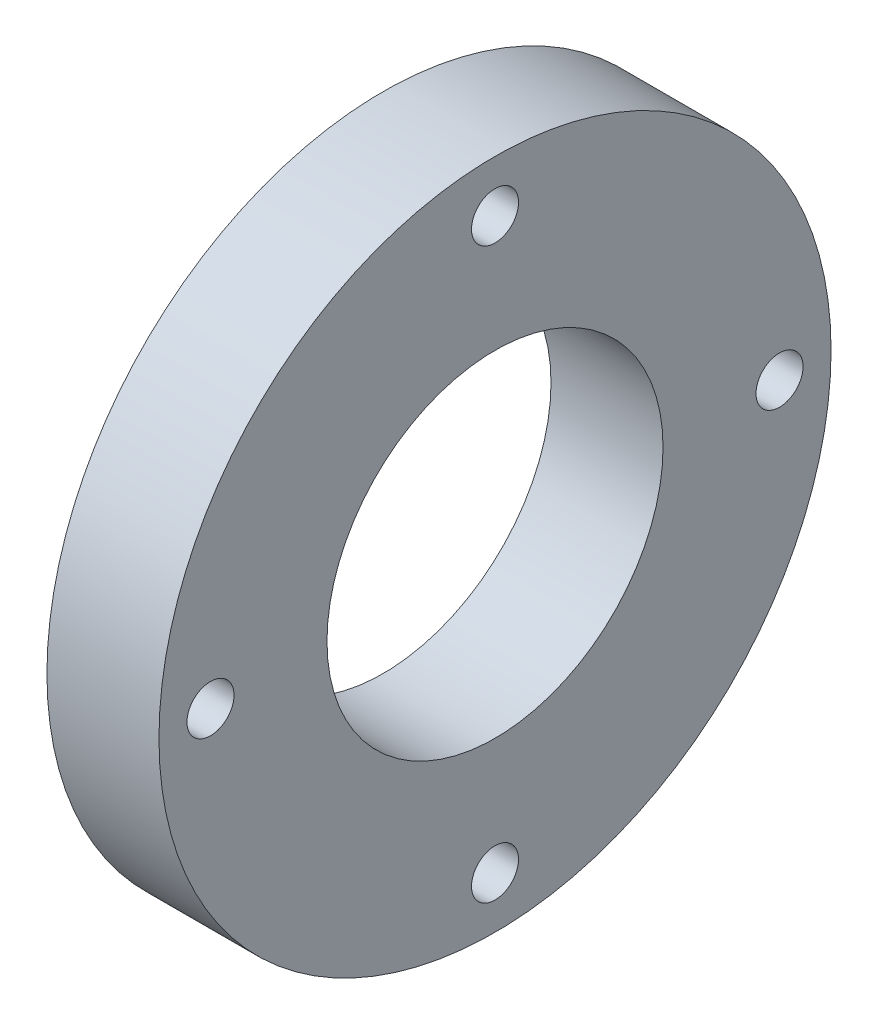
ISO-10303-21;
HEADER;
FILE_DESCRIPTION(('STEP AP214'),'2;1');
FILE_NAME('part.step','',(''),(''),'','','');
FILE_SCHEMA(('AUTOMOTIVE_DESIGN { 1 0 10303 214 1 1 1 1 }'));
ENDSEC;
DATA;
#1=APPLICATION_CONTEXT('core data for automotive mechanical design processes');
#2=APPLICATION_PROTOCOL_DEFINITION('international standard','automotive_design',2000,#1);
#3=PRODUCT_CONTEXT('',#1,'mechanical');
#4=PRODUCT('Part','Part','',(#3));
#5=PRODUCT_RELATED_PRODUCT_CATEGORY('part','',(#4));
#6=PRODUCT_DEFINITION_FORMATION('','',#4);
#7=PRODUCT_DEFINITION_CONTEXT('part definition',#1,'design');
#8=PRODUCT_DEFINITION('design','',#6,#7);
#9=PRODUCT_DEFINITION_SHAPE('','',#8);
#10=(LENGTH_UNIT() NAMED_UNIT(*) SI_UNIT(.MILLI.,.METRE.));
#11=(NAMED_UNIT(*) PLANE_ANGLE_UNIT() SI_UNIT($,.RADIAN.));
#12=(NAMED_UNIT(*) SI_UNIT($,.STERADIAN.) SOLID_ANGLE_UNIT());
#13=UNCERTAINTY_MEASURE_WITH_UNIT(LENGTH_MEASURE(1.E-05),#10,'distance_accuracy_value','');
#14=(GEOMETRIC_REPRESENTATION_CONTEXT(3) GLOBAL_UNCERTAINTY_ASSIGNED_CONTEXT((#13)) GLOBAL_UNIT_ASSIGNED_CONTEXT((#10,
#11,#12)) REPRESENTATION_CONTEXT('',''));
#15=CARTESIAN_POINT('',(0.,0.,0.));
#16=DIRECTION('',(0.,0.,1.));
#17=DIRECTION('',(1.,0.,0.));
#18=AXIS2_PLACEMENT_3D('',#15,#16,#17);
#19=CARTESIAN_POINT('',(21.,0.,0.));
#20=DIRECTION('',(1.,0.,0.));
#21=DIRECTION('',(0.,0.,-1.));
#22=AXIS2_PLACEMENT_3D('',#19,#20,#21);
#23=CYLINDRICAL_SURFACE('',#22,15.);
#24=CARTESIAN_POINT('',(21.,0.,0.));
#25=DIRECTION('',(1.,0.,0.));
#26=DIRECTION('',(0.,0.,-1.));
#27=AXIS2_PLACEMENT_3D('',#24,#25,#26);
#28=CIRCLE('',#27,15.);
#29=CARTESIAN_POINT('',(21.,0.,-15.));
#30=VERTEX_POINT('',#29);
#31=EDGE_CURVE('E10',#30,#30,#28,.T.);
#32=ORIENTED_EDGE('',*,*,#31,.T.);
#33=EDGE_LOOP('',(#32));
#34=FACE_BOUND('',#33,.T.);
#35=CARTESIAN_POINT('',(26.,0.,0.));
#36=DIRECTION('',(1.,0.,0.));
#37=DIRECTION('',(0.,0.,-1.));
#38=AXIS2_PLACEMENT_3D('',#35,#36,#37);
#39=CIRCLE('',#38,15.);
#40=CARTESIAN_POINT('',(26.,0.,-15.));
#41=VERTEX_POINT('',#40);
#42=EDGE_CURVE('E36',#41,#41,#39,.T.);
#43=ORIENTED_EDGE('',*,*,#42,.F.);
#44=EDGE_LOOP('',(#43));
#45=FACE_BOUND('',#44,.T.);
#46=ADVANCED_FACE('F30',(#34,#45),#23,.T.);
#47=CARTESIAN_POINT('',(21.,15.,0.));
#48=DIRECTION('',(-1.,0.,0.));
#49=DIRECTION('',(0.,0.,1.));
#50=AXIS2_PLACEMENT_3D('',#47,#48,#49);
#51=PLANE('',#50);
#52=CARTESIAN_POINT('',(21.,0.,0.));
#53=DIRECTION('',(-1.,0.,0.));
#54=DIRECTION('',(0.,0.,1.));
#55=AXIS2_PLACEMENT_3D('',#52,#53,#54);
#56=CIRCLE('',#55,7.49999999999999);
#57=CARTESIAN_POINT('',(21.,0.,7.49999999999999));
#58=VERTEX_POINT('',#57);
#59=EDGE_CURVE('E44',#58,#58,#56,.T.);
#60=ORIENTED_EDGE('',*,*,#59,.F.);
#61=EDGE_LOOP('',(#60));
#62=FACE_BOUND('',#61,.T.);
#63=ORIENTED_EDGE('',*,*,#31,.F.);
#64=EDGE_LOOP('',(#63));
#65=FACE_BOUND('',#64,.T.);
#66=ADVANCED_FACE('F80',(#62,#65),#51,.T.);
#67=CARTESIAN_POINT('',(26.,0.,0.));
#68=DIRECTION('',(1.,0.,0.));
#69=DIRECTION('',(0.,0.,-1.));
#70=AXIS2_PLACEMENT_3D('',#67,#68,#69);
#71=PLANE('',#70);
#72=CARTESIAN_POINT('',(26.,0.,12.7));
#73=DIRECTION('',(1.,0.,0.));
#74=DIRECTION('',(0.,0.,-1.));
#75=AXIS2_PLACEMENT_3D('',#72,#73,#74);
#76=CIRCLE('',#75,1.04999999999999);
#77=CARTESIAN_POINT('',(26.,0.,11.65));
#78=VERTEX_POINT('',#77);
#79=EDGE_CURVE('E70',#78,#78,#76,.T.);
#80=ORIENTED_EDGE('',*,*,#79,.F.);
#81=EDGE_LOOP('',(#80));
#82=FACE_BOUND('',#81,.T.);
#83=CARTESIAN_POINT('',(26.,0.,-12.7));
#84=DIRECTION('',(1.,0.,0.));
#85=DIRECTION('',(0.,0.,-1.));
#86=AXIS2_PLACEMENT_3D('',#83,#84,#85);
#87=CIRCLE('',#86,1.04999999999999);
#88=CARTESIAN_POINT('',(26.,0.,-13.75));
#89=VERTEX_POINT('',#88);
#90=EDGE_CURVE('E64',#89,#89,#87,.T.);
#91=ORIENTED_EDGE('',*,*,#90,.F.);
#92=EDGE_LOOP('',(#91));
#93=FACE_BOUND('',#92,.T.);
#94=CARTESIAN_POINT('',(26.,-12.7,0.));
#95=DIRECTION('',(1.,0.,0.));
#96=DIRECTION('',(0.,0.,-1.));
#97=AXIS2_PLACEMENT_3D('',#94,#95,#96);
#98=CIRCLE('',#97,1.04999999999999);
#99=CARTESIAN_POINT('',(26.,-12.7,-1.04999999999999));
#100=VERTEX_POINT('',#99);
#101=EDGE_CURVE('E58',#100,#100,#98,.T.);
#102=ORIENTED_EDGE('',*,*,#101,.F.);
#103=EDGE_LOOP('',(#102));
#104=FACE_BOUND('',#103,.T.);
#105=CARTESIAN_POINT('',(26.,12.7,0.));
#106=DIRECTION('',(1.,0.,0.));
#107=DIRECTION('',(0.,0.,-1.));
#108=AXIS2_PLACEMENT_3D('',#105,#106,#107);
#109=CIRCLE('',#108,1.04999999999999);
#110=CARTESIAN_POINT('',(26.,12.7,-1.04999999999999));
#111=VERTEX_POINT('',#110);
#112=EDGE_CURVE('E52',#111,#111,#109,.T.);
#113=ORIENTED_EDGE('',*,*,#112,.F.);
#114=EDGE_LOOP('',(#113));
#115=FACE_BOUND('',#114,.T.);
#116=CARTESIAN_POINT('',(26.,0.,0.));
#117=DIRECTION('',(-1.,0.,0.));
#118=DIRECTION('',(0.,0.,1.));
#119=AXIS2_PLACEMENT_3D('',#116,#117,#118);
#120=CIRCLE('',#119,7.49999999999999);
#121=CARTESIAN_POINT('',(26.,0.,7.49999999999999));
#122=VERTEX_POINT('',#121);
#123=EDGE_CURVE('E40',#122,#122,#120,.T.);
#124=ORIENTED_EDGE('',*,*,#123,.T.);
#125=EDGE_LOOP('',(#124));
#126=FACE_BOUND('',#125,.T.);
#127=ORIENTED_EDGE('',*,*,#42,.T.);
#128=EDGE_LOOP('',(#127));
#129=FACE_BOUND('',#128,.T.);
#130=ADVANCED_FACE('F76',(#82,#93,#104,#115,#126,#129),#71,.T.);
#131=CARTESIAN_POINT('',(21.,0.,0.));
#132=DIRECTION('',(-1.,0.,0.));
#133=DIRECTION('',(0.,0.,1.));
#134=AXIS2_PLACEMENT_3D('',#131,#132,#133);
#135=CYLINDRICAL_SURFACE('',#134,7.49999999999999);
#136=ORIENTED_EDGE('',*,*,#123,.F.);
#137=EDGE_LOOP('',(#136));
#138=FACE_BOUND('',#137,.T.);
#139=ORIENTED_EDGE('',*,*,#59,.T.);
#140=EDGE_LOOP('',(#139));
#141=FACE_BOUND('',#140,.T.);
#142=ADVANCED_FACE('F79',(#138,#141),#135,.F.);
#143=CARTESIAN_POINT('',(23.5,12.7,0.));
#144=DIRECTION('',(-1.,0.,0.));
#145=DIRECTION('',(0.,0.,1.));
#146=AXIS2_PLACEMENT_3D('',#143,#144,#145);
#147=PLANE('',#146);
#148=CARTESIAN_POINT('',(23.5,12.7,0.));
#149=DIRECTION('',(1.,0.,0.));
#150=DIRECTION('',(0.,0.,-1.));
#151=AXIS2_PLACEMENT_3D('',#148,#149,#150);
#152=CIRCLE('',#151,1.04999999999999);
#153=CARTESIAN_POINT('',(23.5,12.7,-1.04999999999999));
#154=VERTEX_POINT('',#153);
#155=EDGE_CURVE('E49',#154,#154,#152,.T.);
#156=ORIENTED_EDGE('',*,*,#155,.T.);
#157=EDGE_LOOP('',(#156));
#158=FACE_BOUND('',#157,.T.);
#159=ADVANCED_FACE('F92',(#158),#147,.F.);
#160=CARTESIAN_POINT('',(26.,12.7,0.));
#161=DIRECTION('',(1.,0.,0.));
#162=DIRECTION('',(0.,0.,-1.));
#163=AXIS2_PLACEMENT_3D('',#160,#161,#162);
#164=CYLINDRICAL_SURFACE('',#163,1.04999999999999);
#165=ORIENTED_EDGE('',*,*,#155,.F.);
#166=EDGE_LOOP('',(#165));
#167=FACE_BOUND('',#166,.T.);
#168=ORIENTED_EDGE('',*,*,#112,.T.);
#169=EDGE_LOOP('',(#168));
#170=FACE_BOUND('',#169,.T.);
#171=ADVANCED_FACE('F104',(#167,#170),#164,.F.);
#172=CARTESIAN_POINT('',(23.5,-12.7,0.));
#173=DIRECTION('',(-1.,0.,0.));
#174=DIRECTION('',(0.,0.,1.));
#175=AXIS2_PLACEMENT_3D('',#172,#173,#174);
#176=PLANE('',#175);
#177=CARTESIAN_POINT('',(23.5,-12.7,0.));
#178=DIRECTION('',(1.,0.,0.));
#179=DIRECTION('',(0.,0.,-1.));
#180=AXIS2_PLACEMENT_3D('',#177,#178,#179);
#181=CIRCLE('',#180,1.04999999999999);
#182=CARTESIAN_POINT('',(23.5,-12.7,-1.04999999999999));
#183=VERTEX_POINT('',#182);
#184=EDGE_CURVE('E55',#183,#183,#181,.T.);
#185=ORIENTED_EDGE('',*,*,#184,.T.);
#186=EDGE_LOOP('',(#185));
#187=FACE_BOUND('',#186,.T.);
#188=ADVANCED_FACE('F108',(#187),#176,.F.);
#189=CARTESIAN_POINT('',(26.,-12.7,0.));
#190=DIRECTION('',(1.,0.,0.));
#191=DIRECTION('',(0.,0.,-1.));
#192=AXIS2_PLACEMENT_3D('',#189,#190,#191);
#193=CYLINDRICAL_SURFACE('',#192,1.04999999999999);
#194=ORIENTED_EDGE('',*,*,#184,.F.);
#195=EDGE_LOOP('',(#194));
#196=FACE_BOUND('',#195,.T.);
#197=ORIENTED_EDGE('',*,*,#101,.T.);
#198=EDGE_LOOP('',(#197));
#199=FACE_BOUND('',#198,.T.);
#200=ADVANCED_FACE('F112',(#196,#199),#193,.F.);
#201=CARTESIAN_POINT('',(23.5,0.,-12.7));
#202=DIRECTION('',(-1.,0.,0.));
#203=DIRECTION('',(0.,0.,1.));
#204=AXIS2_PLACEMENT_3D('',#201,#202,#203);
#205=PLANE('',#204);
#206=CARTESIAN_POINT('',(23.5,0.,-12.7));
#207=DIRECTION('',(1.,0.,0.));
#208=DIRECTION('',(0.,0.,-1.));
#209=AXIS2_PLACEMENT_3D('',#206,#207,#208);
#210=CIRCLE('',#209,1.04999999999999);
#211=CARTESIAN_POINT('',(23.5,0.,-13.75));
#212=VERTEX_POINT('',#211);
#213=EDGE_CURVE('E61',#212,#212,#210,.T.);
#214=ORIENTED_EDGE('',*,*,#213,.T.);
#215=EDGE_LOOP('',(#214));
#216=FACE_BOUND('',#215,.T.);
#217=ADVANCED_FACE('F116',(#216),#205,.F.);
#218=CARTESIAN_POINT('',(26.,0.,-12.7));
#219=DIRECTION('',(1.,0.,0.));
#220=DIRECTION('',(0.,0.,-1.));
#221=AXIS2_PLACEMENT_3D('',#218,#219,#220);
#222=CYLINDRICAL_SURFACE('',#221,1.04999999999999);
#223=ORIENTED_EDGE('',*,*,#213,.F.);
#224=EDGE_LOOP('',(#223));
#225=FACE_BOUND('',#224,.T.);
#226=ORIENTED_EDGE('',*,*,#90,.T.);
#227=EDGE_LOOP('',(#226));
#228=FACE_BOUND('',#227,.T.);
#229=ADVANCED_FACE('F120',(#225,#228),#222,.F.);
#230=CARTESIAN_POINT('',(23.5,0.,12.7));
#231=DIRECTION('',(-1.,0.,0.));
#232=DIRECTION('',(0.,0.,1.));
#233=AXIS2_PLACEMENT_3D('',#230,#231,#232);
#234=PLANE('',#233);
#235=CARTESIAN_POINT('',(23.5,0.,12.7));
#236=DIRECTION('',(1.,0.,0.));
#237=DIRECTION('',(0.,0.,-1.));
#238=AXIS2_PLACEMENT_3D('',#235,#236,#237);
#239=CIRCLE('',#238,1.04999999999999);
#240=CARTESIAN_POINT('',(23.5,0.,11.65));
#241=VERTEX_POINT('',#240);
#242=EDGE_CURVE('E67',#241,#241,#239,.T.);
#243=ORIENTED_EDGE('',*,*,#242,.T.);
#244=EDGE_LOOP('',(#243));
#245=FACE_BOUND('',#244,.T.);
#246=ADVANCED_FACE('F124',(#245),#234,.F.);
#247=CARTESIAN_POINT('',(26.,0.,12.7));
#248=DIRECTION('',(1.,0.,0.));
#249=DIRECTION('',(0.,0.,-1.));
#250=AXIS2_PLACEMENT_3D('',#247,#248,#249);
#251=CYLINDRICAL_SURFACE('',#250,1.04999999999999);
#252=ORIENTED_EDGE('',*,*,#242,.F.);
#253=EDGE_LOOP('',(#252));
#254=FACE_BOUND('',#253,.T.);
#255=ORIENTED_EDGE('',*,*,#79,.T.);
#256=EDGE_LOOP('',(#255));
#257=FACE_BOUND('',#256,.T.);
#258=ADVANCED_FACE('F74',(#254,#257),#251,.F.);
#259=CLOSED_SHELL('',(#46,#66,#130,#142,#159,#171,#188,#200,#217,#229,#246,#258));
#260=MANIFOLD_SOLID_BREP('B2',#259);
#261=ADVANCED_BREP_SHAPE_REPRESENTATION('',(#18,#260),#14);
#262=SHAPE_DEFINITION_REPRESENTATION(#9,#261);
ENDSEC;
END-ISO-10303-21;
